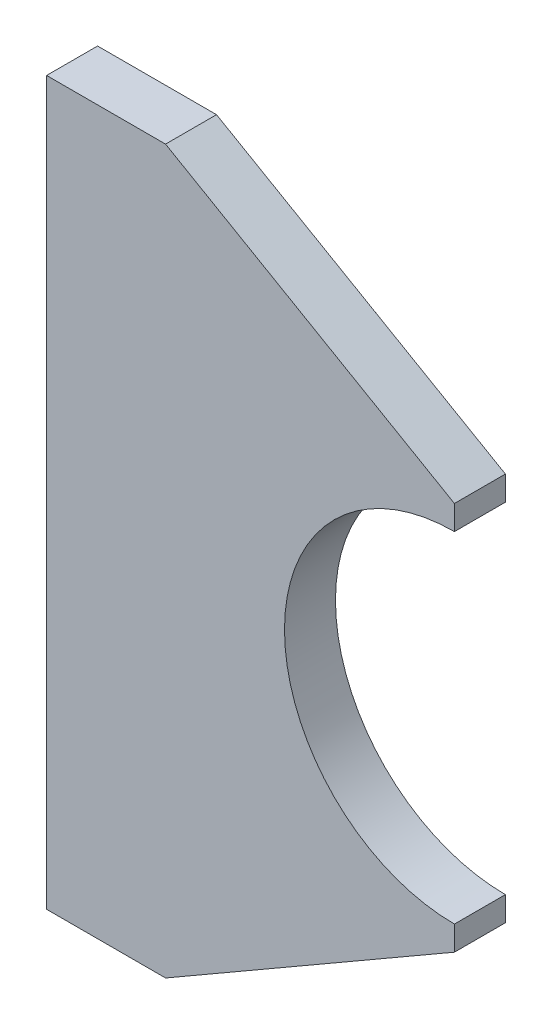
ISO-10303-21;
HEADER;
FILE_DESCRIPTION(('STEP AP214'),'2;1');
FILE_NAME('part.step','',(''),(''),'','','');
FILE_SCHEMA(('AUTOMOTIVE_DESIGN { 1 0 10303 214 1 1 1 1 }'));
ENDSEC;
DATA;
#1=APPLICATION_CONTEXT('core data for automotive mechanical design processes');
#2=APPLICATION_PROTOCOL_DEFINITION('international standard','automotive_design',2000,#1);
#3=PRODUCT_CONTEXT('',#1,'mechanical');
#4=PRODUCT('Part','Part','',(#3));
#5=PRODUCT_RELATED_PRODUCT_CATEGORY('part','',(#4));
#6=PRODUCT_DEFINITION_FORMATION('','',#4);
#7=PRODUCT_DEFINITION_CONTEXT('part definition',#1,'design');
#8=PRODUCT_DEFINITION('design','',#6,#7);
#9=PRODUCT_DEFINITION_SHAPE('','',#8);
#10=(LENGTH_UNIT() NAMED_UNIT(*) SI_UNIT(.MILLI.,.METRE.));
#11=(NAMED_UNIT(*) PLANE_ANGLE_UNIT() SI_UNIT($,.RADIAN.));
#12=(NAMED_UNIT(*) SI_UNIT($,.STERADIAN.) SOLID_ANGLE_UNIT());
#13=UNCERTAINTY_MEASURE_WITH_UNIT(LENGTH_MEASURE(1.E-05),#10,'distance_accuracy_value','');
#14=(GEOMETRIC_REPRESENTATION_CONTEXT(3) GLOBAL_UNCERTAINTY_ASSIGNED_CONTEXT((#13)) GLOBAL_UNIT_ASSIGNED_CONTEXT((#10,
#11,#12)) REPRESENTATION_CONTEXT('',''));
#15=CARTESIAN_POINT('',(0.,0.,0.));
#16=DIRECTION('',(0.,0.,1.));
#17=DIRECTION('',(1.,0.,0.));
#18=AXIS2_PLACEMENT_3D('',#15,#16,#17);
#19=CARTESIAN_POINT('',(0.,-20.,3.));
#20=DIRECTION('',(-1.,0.,0.));
#21=DIRECTION('',(0.,-1.,0.));
#22=AXIS2_PLACEMENT_3D('',#19,#20,#21);
#23=PLANE('',#22);
#24=DIRECTION('',(0.,1.,0.));
#25=VECTOR('',#24,1.);
#26=CARTESIAN_POINT('',(0.,-20.,-3.));
#27=LINE('',#26,#25);
#28=CARTESIAN_POINT('',(0.,-22.8700908475527,-3.));
#29=VERTEX_POINT('',#28);
#30=CARTESIAN_POINT('',(0.,-20.,-3.));
#31=VERTEX_POINT('',#30);
#32=EDGE_CURVE('E130',#29,#31,#27,.T.);
#33=ORIENTED_EDGE('',*,*,#32,.T.);
#34=DIRECTION('',(0.,0.,-1.));
#35=VECTOR('',#34,1.);
#36=CARTESIAN_POINT('',(0.,-20.,3.));
#37=LINE('',#36,#35);
#38=CARTESIAN_POINT('',(0.,-20.,3.));
#39=VERTEX_POINT('',#38);
#40=EDGE_CURVE('E11',#39,#31,#37,.T.);
#41=ORIENTED_EDGE('',*,*,#40,.F.);
#42=DIRECTION('',(0.,1.,0.));
#43=VECTOR('',#42,1.);
#44=CARTESIAN_POINT('',(0.,-20.,3.));
#45=LINE('',#44,#43);
#46=CARTESIAN_POINT('',(0.,-22.8700908475527,3.));
#47=VERTEX_POINT('',#46);
#48=EDGE_CURVE('E144',#47,#39,#45,.T.);
#49=ORIENTED_EDGE('',*,*,#48,.F.);
#50=DIRECTION('',(0.,0.,-1.));
#51=VECTOR('',#50,1.);
#52=CARTESIAN_POINT('',(0.,-22.8700908475527,3.));
#53=LINE('',#52,#51);
#54=EDGE_CURVE('E126',#47,#29,#53,.T.);
#55=ORIENTED_EDGE('',*,*,#54,.T.);
#56=EDGE_LOOP('',(#33,#41,#49,#55));
#57=FACE_BOUND('',#56,.T.);
#58=ADVANCED_FACE('F34',(#57),#23,.F.);
#59=CARTESIAN_POINT('',(0.,0.,3.));
#60=DIRECTION('',(0.,0.,-1.));
#61=DIRECTION('',(-1.,0.,0.));
#62=AXIS2_PLACEMENT_3D('',#59,#60,#61);
#63=CYLINDRICAL_SURFACE('',#62,20.);
#64=CARTESIAN_POINT('',(0.,0.,-3.));
#65=DIRECTION('',(0.,0.,-1.));
#66=DIRECTION('',(1.,0.,0.));
#67=AXIS2_PLACEMENT_3D('',#64,#65,#66);
#68=CIRCLE('',#67,20.);
#69=CARTESIAN_POINT('',(0.,20.,-3.));
#70=VERTEX_POINT('',#69);
#71=EDGE_CURVE('E133',#31,#70,#68,.T.);
#72=ORIENTED_EDGE('',*,*,#71,.T.);
#73=DIRECTION('',(0.,0.,-1.));
#74=VECTOR('',#73,1.);
#75=CARTESIAN_POINT('',(0.,20.,3.));
#76=LINE('',#75,#74);
#77=CARTESIAN_POINT('',(0.,20.,3.));
#78=VERTEX_POINT('',#77);
#79=EDGE_CURVE('E42',#78,#70,#76,.T.);
#80=ORIENTED_EDGE('',*,*,#79,.F.);
#81=CARTESIAN_POINT('',(0.,0.,3.));
#82=DIRECTION('',(0.,0.,-1.));
#83=DIRECTION('',(1.,0.,0.));
#84=AXIS2_PLACEMENT_3D('',#81,#82,#83);
#85=CIRCLE('',#84,20.);
#86=EDGE_CURVE('E93',#39,#78,#85,.T.);
#87=ORIENTED_EDGE('',*,*,#86,.F.);
#88=ORIENTED_EDGE('',*,*,#40,.T.);
#89=EDGE_LOOP('',(#72,#80,#87,#88));
#90=FACE_BOUND('',#89,.T.);
#91=ADVANCED_FACE('F179',(#90),#63,.F.);
#92=CARTESIAN_POINT('',(0.,20.,3.));
#93=DIRECTION('',(-1.,0.,0.));
#94=DIRECTION('',(0.,-1.,0.));
#95=AXIS2_PLACEMENT_3D('',#92,#93,#94);
#96=PLANE('',#95);
#97=DIRECTION('',(0.,1.,0.));
#98=VECTOR('',#97,1.);
#99=CARTESIAN_POINT('',(0.,20.,-3.));
#100=LINE('',#99,#98);
#101=CARTESIAN_POINT('',(0.,22.8700908475527,-3.));
#102=VERTEX_POINT('',#101);
#103=EDGE_CURVE('E135',#70,#102,#100,.T.);
#104=ORIENTED_EDGE('',*,*,#103,.T.);
#105=DIRECTION('',(0.,0.,-1.));
#106=VECTOR('',#105,1.);
#107=CARTESIAN_POINT('',(0.,22.8700908475527,3.));
#108=LINE('',#107,#106);
#109=CARTESIAN_POINT('',(0.,22.8700908475527,3.));
#110=VERTEX_POINT('',#109);
#111=EDGE_CURVE('E151',#110,#102,#108,.T.);
#112=ORIENTED_EDGE('',*,*,#111,.F.);
#113=DIRECTION('',(0.,1.,0.));
#114=VECTOR('',#113,1.);
#115=CARTESIAN_POINT('',(0.,20.,3.));
#116=LINE('',#115,#114);
#117=EDGE_CURVE('E159',#78,#110,#116,.T.);
#118=ORIENTED_EDGE('',*,*,#117,.F.);
#119=ORIENTED_EDGE('',*,*,#79,.T.);
#120=EDGE_LOOP('',(#104,#112,#118,#119));
#121=FACE_BOUND('',#120,.T.);
#122=ADVANCED_FACE('F157',(#121),#96,.F.);
#123=CARTESIAN_POINT('',(-34.,42.5,3.));
#124=DIRECTION('',(-0.500000000000001,-0.866025403784438,0.));
#125=DIRECTION('',(0.866025403784438,-0.500000000000001,0.));
#126=AXIS2_PLACEMENT_3D('',#123,#124,#125);
#127=PLANE('',#126);
#128=DIRECTION('',(-0.866025403784438,0.500000000000001,0.));
#129=VECTOR('',#128,1.);
#130=CARTESIAN_POINT('',(-34.,42.5,-3.));
#131=LINE('',#130,#129);
#132=CARTESIAN_POINT('',(-34.,42.5,-3.));
#133=VERTEX_POINT('',#132);
#134=EDGE_CURVE('E137',#102,#133,#131,.T.);
#135=ORIENTED_EDGE('',*,*,#134,.T.);
#136=DIRECTION('',(0.,0.,-1.));
#137=VECTOR('',#136,1.);
#138=CARTESIAN_POINT('',(-34.,42.5,3.));
#139=LINE('',#138,#137);
#140=CARTESIAN_POINT('',(-34.,42.5,3.));
#141=VERTEX_POINT('',#140);
#142=EDGE_CURVE('E148',#141,#133,#139,.T.);
#143=ORIENTED_EDGE('',*,*,#142,.F.);
#144=DIRECTION('',(-0.866025403784438,0.500000000000001,0.));
#145=VECTOR('',#144,1.);
#146=CARTESIAN_POINT('',(-34.,42.5,3.));
#147=LINE('',#146,#145);
#148=EDGE_CURVE('E171',#110,#141,#147,.T.);
#149=ORIENTED_EDGE('',*,*,#148,.F.);
#150=ORIENTED_EDGE('',*,*,#111,.T.);
#151=EDGE_LOOP('',(#135,#143,#149,#150));
#152=FACE_BOUND('',#151,.T.);
#153=ADVANCED_FACE('F167',(#152),#127,.F.);
#154=CARTESIAN_POINT('',(-48.,42.5,3.));
#155=DIRECTION('',(0.,-1.,0.));
#156=DIRECTION('',(1.,0.,0.));
#157=AXIS2_PLACEMENT_3D('',#154,#155,#156);
#158=PLANE('',#157);
#159=DIRECTION('',(-1.,0.,0.));
#160=VECTOR('',#159,1.);
#161=CARTESIAN_POINT('',(-48.,42.5,-3.));
#162=LINE('',#161,#160);
#163=CARTESIAN_POINT('',(-48.,42.5,-3.));
#164=VERTEX_POINT('',#163);
#165=EDGE_CURVE('E139',#133,#164,#162,.T.);
#166=ORIENTED_EDGE('',*,*,#165,.T.);
#167=DIRECTION('',(0.,0.,-1.));
#168=VECTOR('',#167,1.);
#169=CARTESIAN_POINT('',(-48.,42.5,3.));
#170=LINE('',#169,#168);
#171=CARTESIAN_POINT('',(-48.,42.5,3.));
#172=VERTEX_POINT('',#171);
#173=EDGE_CURVE('E121',#172,#164,#170,.T.);
#174=ORIENTED_EDGE('',*,*,#173,.F.);
#175=DIRECTION('',(-1.,0.,0.));
#176=VECTOR('',#175,1.);
#177=CARTESIAN_POINT('',(-48.,42.5,3.));
#178=LINE('',#177,#176);
#179=EDGE_CURVE('E112',#141,#172,#178,.T.);
#180=ORIENTED_EDGE('',*,*,#179,.F.);
#181=ORIENTED_EDGE('',*,*,#142,.T.);
#182=EDGE_LOOP('',(#166,#174,#180,#181));
#183=FACE_BOUND('',#182,.T.);
#184=ADVANCED_FACE('F170',(#183),#158,.F.);
#185=CARTESIAN_POINT('',(-48.,-42.5,3.));
#186=DIRECTION('',(1.,0.,0.));
#187=DIRECTION('',(0.,1.,0.));
#188=AXIS2_PLACEMENT_3D('',#185,#186,#187);
#189=PLANE('',#188);
#190=DIRECTION('',(0.,-1.,0.));
#191=VECTOR('',#190,1.);
#192=CARTESIAN_POINT('',(-48.,-42.5,-3.));
#193=LINE('',#192,#191);
#194=CARTESIAN_POINT('',(-48.,-42.5,-3.));
#195=VERTEX_POINT('',#194);
#196=EDGE_CURVE('E120',#164,#195,#193,.T.);
#197=ORIENTED_EDGE('',*,*,#196,.T.);
#198=DIRECTION('',(0.,0.,-1.));
#199=VECTOR('',#198,1.);
#200=CARTESIAN_POINT('',(-48.,-42.5,3.));
#201=LINE('',#200,#199);
#202=CARTESIAN_POINT('',(-48.,-42.5,3.));
#203=VERTEX_POINT('',#202);
#204=EDGE_CURVE('E117',#203,#195,#201,.T.);
#205=ORIENTED_EDGE('',*,*,#204,.F.);
#206=DIRECTION('',(0.,-1.,0.));
#207=VECTOR('',#206,1.);
#208=CARTESIAN_POINT('',(-48.,-42.5,3.));
#209=LINE('',#208,#207);
#210=EDGE_CURVE('E106',#172,#203,#209,.T.);
#211=ORIENTED_EDGE('',*,*,#210,.F.);
#212=ORIENTED_EDGE('',*,*,#173,.T.);
#213=EDGE_LOOP('',(#197,#205,#211,#212));
#214=FACE_BOUND('',#213,.T.);
#215=ADVANCED_FACE('F118',(#214),#189,.F.);
#216=CARTESIAN_POINT('',(-48.,-42.5,3.));
#217=DIRECTION('',(0.,1.,0.));
#218=DIRECTION('',(-1.,0.,0.));
#219=AXIS2_PLACEMENT_3D('',#216,#217,#218);
#220=PLANE('',#219);
#221=DIRECTION('',(1.,0.,0.));
#222=VECTOR('',#221,1.);
#223=CARTESIAN_POINT('',(-48.,-42.5,-3.));
#224=LINE('',#223,#222);
#225=CARTESIAN_POINT('',(-34.,-42.5,-3.));
#226=VERTEX_POINT('',#225);
#227=EDGE_CURVE('E79',#195,#226,#224,.T.);
#228=ORIENTED_EDGE('',*,*,#227,.T.);
#229=DIRECTION('',(0.,0.,-1.));
#230=VECTOR('',#229,1.);
#231=CARTESIAN_POINT('',(-34.,-42.5,3.));
#232=LINE('',#231,#230);
#233=CARTESIAN_POINT('',(-34.,-42.5,3.));
#234=VERTEX_POINT('',#233);
#235=EDGE_CURVE('E122',#234,#226,#232,.T.);
#236=ORIENTED_EDGE('',*,*,#235,.F.);
#237=DIRECTION('',(1.,0.,0.));
#238=VECTOR('',#237,1.);
#239=CARTESIAN_POINT('',(-48.,-42.5,3.));
#240=LINE('',#239,#238);
#241=EDGE_CURVE('E110',#203,#234,#240,.T.);
#242=ORIENTED_EDGE('',*,*,#241,.F.);
#243=ORIENTED_EDGE('',*,*,#204,.T.);
#244=EDGE_LOOP('',(#228,#236,#242,#243));
#245=FACE_BOUND('',#244,.T.);
#246=ADVANCED_FACE('F124',(#245),#220,.F.);
#247=CARTESIAN_POINT('',(-34.,-42.5,3.));
#248=DIRECTION('',(-0.500000000000001,0.866025403784438,0.));
#249=DIRECTION('',(-0.866025403784438,-0.500000000000001,0.));
#250=AXIS2_PLACEMENT_3D('',#247,#248,#249);
#251=PLANE('',#250);
#252=DIRECTION('',(0.866025403784438,0.500000000000001,0.));
#253=VECTOR('',#252,1.);
#254=CARTESIAN_POINT('',(-34.,-42.5,-3.));
#255=LINE('',#254,#253);
#256=EDGE_CURVE('E85',#226,#29,#255,.T.);
#257=ORIENTED_EDGE('',*,*,#256,.T.);
#258=ORIENTED_EDGE('',*,*,#54,.F.);
#259=DIRECTION('',(0.866025403784438,0.500000000000001,0.));
#260=VECTOR('',#259,1.);
#261=CARTESIAN_POINT('',(-34.,-42.5,3.));
#262=LINE('',#261,#260);
#263=EDGE_CURVE('E50',#234,#47,#262,.T.);
#264=ORIENTED_EDGE('',*,*,#263,.F.);
#265=ORIENTED_EDGE('',*,*,#235,.T.);
#266=EDGE_LOOP('',(#257,#258,#264,#265));
#267=FACE_BOUND('',#266,.T.);
#268=ADVANCED_FACE('F195',(#267),#251,.F.);
#269=CARTESIAN_POINT('',(0.,0.,3.));
#270=DIRECTION('',(0.,0.,1.));
#271=DIRECTION('',(1.,0.,0.));
#272=AXIS2_PLACEMENT_3D('',#269,#270,#271);
#273=PLANE('',#272);
#274=ORIENTED_EDGE('',*,*,#48,.T.);
#275=ORIENTED_EDGE('',*,*,#86,.T.);
#276=ORIENTED_EDGE('',*,*,#117,.T.);
#277=ORIENTED_EDGE('',*,*,#148,.T.);
#278=ORIENTED_EDGE('',*,*,#179,.T.);
#279=ORIENTED_EDGE('',*,*,#210,.T.);
#280=ORIENTED_EDGE('',*,*,#241,.T.);
#281=ORIENTED_EDGE('',*,*,#263,.T.);
#282=EDGE_LOOP('',(#274,#275,#276,#277,#278,#279,#280,#281));
#283=FACE_BOUND('',#282,.T.);
#284=ADVANCED_FACE('F108',(#283),#273,.T.);
#285=CARTESIAN_POINT('',(0.,0.,-3.));
#286=DIRECTION('',(0.,0.,1.));
#287=DIRECTION('',(1.,0.,0.));
#288=AXIS2_PLACEMENT_3D('',#285,#286,#287);
#289=PLANE('',#288);
#290=ORIENTED_EDGE('',*,*,#32,.F.);
#291=ORIENTED_EDGE('',*,*,#256,.F.);
#292=ORIENTED_EDGE('',*,*,#227,.F.);
#293=ORIENTED_EDGE('',*,*,#196,.F.);
#294=ORIENTED_EDGE('',*,*,#165,.F.);
#295=ORIENTED_EDGE('',*,*,#134,.F.);
#296=ORIENTED_EDGE('',*,*,#103,.F.);
#297=ORIENTED_EDGE('',*,*,#71,.F.);
#298=EDGE_LOOP('',(#290,#291,#292,#293,#294,#295,#296,#297));
#299=FACE_BOUND('',#298,.T.);
#300=ADVANCED_FACE('F163',(#299),#289,.F.);
#301=CLOSED_SHELL('',(#58,#91,#122,#153,#184,#215,#246,#268,#284,#300));
#302=MANIFOLD_SOLID_BREP('B2',#301);
#303=ADVANCED_BREP_SHAPE_REPRESENTATION('',(#18,#302),#14);
#304=SHAPE_DEFINITION_REPRESENTATION(#9,#303);
ENDSEC;
END-ISO-10303-21;
